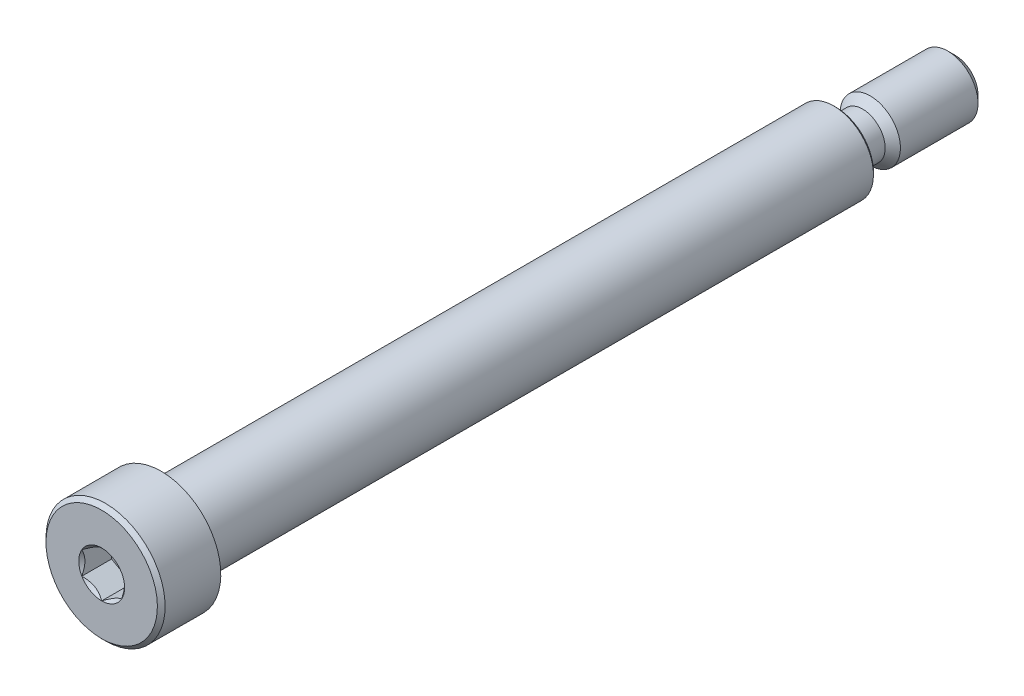
ISO-10303-21;
HEADER;
FILE_DESCRIPTION(('STEP AP214'),'2;1');
FILE_NAME('part.step','',(''),(''),'','','');
FILE_SCHEMA(('AUTOMOTIVE_DESIGN { 1 0 10303 214 1 1 1 1 }'));
ENDSEC;
DATA;
#1=APPLICATION_CONTEXT('core data for automotive mechanical design processes');
#2=APPLICATION_PROTOCOL_DEFINITION('international standard','automotive_design',2000,#1);
#3=PRODUCT_CONTEXT('',#1,'mechanical');
#4=PRODUCT('Part','Part','',(#3));
#5=PRODUCT_RELATED_PRODUCT_CATEGORY('part','',(#4));
#6=PRODUCT_DEFINITION_FORMATION('','',#4);
#7=PRODUCT_DEFINITION_CONTEXT('part definition',#1,'design');
#8=PRODUCT_DEFINITION('design','',#6,#7);
#9=PRODUCT_DEFINITION_SHAPE('','',#8);
#10=(LENGTH_UNIT() NAMED_UNIT(*) SI_UNIT(.MILLI.,.METRE.));
#11=(NAMED_UNIT(*) PLANE_ANGLE_UNIT() SI_UNIT($,.RADIAN.));
#12=(NAMED_UNIT(*) SI_UNIT($,.STERADIAN.) SOLID_ANGLE_UNIT());
#13=UNCERTAINTY_MEASURE_WITH_UNIT(LENGTH_MEASURE(1.E-05),#10,'distance_accuracy_value','');
#14=(GEOMETRIC_REPRESENTATION_CONTEXT(3) GLOBAL_UNCERTAINTY_ASSIGNED_CONTEXT((#13)) GLOBAL_UNIT_ASSIGNED_CONTEXT((#10,
#11,#12)) REPRESENTATION_CONTEXT('',''));
#15=CARTESIAN_POINT('',(0.,0.,0.));
#16=DIRECTION('',(0.,0.,1.));
#17=DIRECTION('',(1.,0.,0.));
#18=AXIS2_PLACEMENT_3D('',#15,#16,#17);
#19=CARTESIAN_POINT('',(0.,0.,0.));
#20=DIRECTION('',(0.,0.,1.));
#21=DIRECTION('',(0.,-1.,0.));
#22=AXIS2_PLACEMENT_3D('',#19,#20,#21);
#23=PLANE('',#22);
#24=CARTESIAN_POINT('',(0.,0.,0.));
#25=DIRECTION('',(0.,0.,1.));
#26=DIRECTION('',(1.,0.,0.));
#27=AXIS2_PLACEMENT_3D('',#24,#25,#26);
#28=CIRCLE('',#27,1.83308710467706);
#29=CARTESIAN_POINT('',(0.,-1.83308710467706,0.));
#30=VERTEX_POINT('',#29);
#31=CARTESIAN_POINT('',(1.58749999999999,-0.916543552338543,0.));
#32=VERTEX_POINT('',#31);
#33=EDGE_CURVE('E56',#30,#32,#28,.T.);
#34=ORIENTED_EDGE('',*,*,#33,.F.);
#35=CARTESIAN_POINT('',(-1.5875,-0.916543552338536,0.));
#36=VERTEX_POINT('',#35);
#37=EDGE_CURVE('E63',#36,#30,#28,.T.);
#38=ORIENTED_EDGE('',*,*,#37,.F.);
#39=CARTESIAN_POINT('',(-1.5875,0.916543552338528,0.));
#40=VERTEX_POINT('',#39);
#41=EDGE_CURVE('E136',#40,#36,#28,.T.);
#42=ORIENTED_EDGE('',*,*,#41,.F.);
#43=CARTESIAN_POINT('',(0.,1.83308710467706,0.));
#44=VERTEX_POINT('',#43);
#45=EDGE_CURVE('E131',#44,#40,#28,.T.);
#46=ORIENTED_EDGE('',*,*,#45,.F.);
#47=CARTESIAN_POINT('',(1.5875,0.916543552338529,0.));
#48=VERTEX_POINT('',#47);
#49=EDGE_CURVE('E104',#48,#44,#28,.T.);
#50=ORIENTED_EDGE('',*,*,#49,.F.);
#51=EDGE_CURVE('E95',#32,#48,#28,.T.);
#52=ORIENTED_EDGE('',*,*,#51,.F.);
#53=EDGE_LOOP('',(#34,#38,#42,#46,#50,#52));
#54=FACE_BOUND('',#53,.T.);
#55=CARTESIAN_POINT('',(0.,0.,0.));
#56=DIRECTION('',(0.,0.,1.));
#57=DIRECTION('',(0.,-1.,0.));
#58=AXIS2_PLACEMENT_3D('',#55,#56,#57);
#59=CIRCLE('',#58,4.45293749999999);
#60=CARTESIAN_POINT('',(0.,-4.45293749999999,0.));
#61=VERTEX_POINT('',#60);
#62=EDGE_CURVE('E221',#61,#61,#59,.T.);
#63=ORIENTED_EDGE('',*,*,#62,.T.);
#64=EDGE_LOOP('',(#63));
#65=FACE_BOUND('',#64,.T.);
#66=ADVANCED_FACE('F36',(#54,#65),#23,.T.);
#67=CARTESIAN_POINT('',(0.,0.,-68.2625));
#68=DIRECTION('',(0.,0.,-1.));
#69=DIRECTION('',(0.,1.,0.));
#70=AXIS2_PLACEMENT_3D('',#67,#68,#69);
#71=CYLINDRICAL_SURFACE('',#70,4.7625);
#72=CARTESIAN_POINT('',(0.,0.,-0.309562499999999));
#73=DIRECTION('',(0.,0.,1.));
#74=DIRECTION('',(0.,-1.,0.));
#75=AXIS2_PLACEMENT_3D('',#72,#73,#74);
#76=CIRCLE('',#75,4.7625);
#77=CARTESIAN_POINT('',(0.,-4.7625,-0.309562499999998));
#78=VERTEX_POINT('',#77);
#79=EDGE_CURVE('E224',#78,#78,#76,.F.);
#80=ORIENTED_EDGE('',*,*,#79,.T.);
#81=EDGE_LOOP('',(#80));
#82=FACE_BOUND('',#81,.T.);
#83=CARTESIAN_POINT('',(0.,0.,-4.7625));
#84=DIRECTION('',(0.,0.,-1.));
#85=DIRECTION('',(0.,1.,0.));
#86=AXIS2_PLACEMENT_3D('',#83,#84,#85);
#87=CIRCLE('',#86,4.7625);
#88=CARTESIAN_POINT('',(0.,4.7625,-4.7625));
#89=VERTEX_POINT('',#88);
#90=EDGE_CURVE('E265',#89,#89,#87,.T.);
#91=ORIENTED_EDGE('',*,*,#90,.F.);
#92=EDGE_LOOP('',(#91));
#93=FACE_BOUND('',#92,.T.);
#94=ADVANCED_FACE('F197',(#82,#93),#71,.T.);
#95=CARTESIAN_POINT('',(0.,-4.7625,-4.7625));
#96=DIRECTION('',(0.,0.,-1.));
#97=DIRECTION('',(0.,1.,0.));
#98=AXIS2_PLACEMENT_3D('',#95,#96,#97);
#99=PLANE('',#98);
#100=ORIENTED_EDGE('',*,*,#90,.T.);
#101=EDGE_LOOP('',(#100));
#102=FACE_BOUND('',#101,.T.);
#103=CARTESIAN_POINT('',(0.,0.,-4.7625));
#104=DIRECTION('',(0.,0.,-1.));
#105=DIRECTION('',(0.,1.,0.));
#106=AXIS2_PLACEMENT_3D('',#103,#104,#105);
#107=CIRCLE('',#106,3.17499999999998);
#108=CARTESIAN_POINT('',(0.,3.17499999999998,-4.7625));
#109=VERTEX_POINT('',#108);
#110=EDGE_CURVE('E256',#109,#109,#107,.T.);
#111=ORIENTED_EDGE('',*,*,#110,.F.);
#112=EDGE_LOOP('',(#111));
#113=FACE_BOUND('',#112,.T.);
#114=ADVANCED_FACE('F202',(#102,#113),#99,.T.);
#115=CARTESIAN_POINT('',(0.,0.,-68.2625));
#116=DIRECTION('',(0.,0.,-1.));
#117=DIRECTION('',(0.,1.,0.));
#118=AXIS2_PLACEMENT_3D('',#115,#116,#117);
#119=CYLINDRICAL_SURFACE('',#118,3.17499999999999);
#120=CARTESIAN_POINT('',(0.,0.,-58.5343));
#121=DIRECTION('',(0.,0.,-1.));
#122=DIRECTION('',(0.,1.,0.));
#123=AXIS2_PLACEMENT_3D('',#120,#121,#122);
#124=CIRCLE('',#123,3.17499999999999);
#125=CARTESIAN_POINT('',(0.,3.17499999999997,-58.5343));
#126=VERTEX_POINT('',#125);
#127=EDGE_CURVE('E50',#126,#126,#124,.F.);
#128=ORIENTED_EDGE('',*,*,#127,.T.);
#129=EDGE_LOOP('',(#128));
#130=FACE_BOUND('',#129,.T.);
#131=ORIENTED_EDGE('',*,*,#110,.T.);
#132=EDGE_LOOP('',(#131));
#133=FACE_BOUND('',#132,.T.);
#134=ADVANCED_FACE('F238',(#130,#133),#119,.T.);
#135=CARTESIAN_POINT('',(0.,-3.17500000000001,-58.7375));
#136=DIRECTION('',(0.,0.,-1.));
#137=DIRECTION('',(0.,1.,0.));
#138=AXIS2_PLACEMENT_3D('',#135,#136,#137);
#139=PLANE('',#138);
#140=CARTESIAN_POINT('',(0.,0.,-58.7375));
#141=DIRECTION('',(0.,0.,-1.));
#142=DIRECTION('',(0.,1.,0.));
#143=AXIS2_PLACEMENT_3D('',#140,#141,#142);
#144=CIRCLE('',#143,2.97179999999998);
#145=CARTESIAN_POINT('',(0.,2.97179999999997,-58.7375));
#146=VERTEX_POINT('',#145);
#147=EDGE_CURVE('E227',#146,#146,#144,.T.);
#148=ORIENTED_EDGE('',*,*,#147,.T.);
#149=EDGE_LOOP('',(#148));
#150=FACE_BOUND('',#149,.T.);
#151=CARTESIAN_POINT('',(0.,0.,-58.7375));
#152=DIRECTION('',(0.,0.,-1.));
#153=DIRECTION('',(0.,1.,0.));
#154=AXIS2_PLACEMENT_3D('',#151,#152,#153);
#155=CIRCLE('',#154,2.41300000000004);
#156=CARTESIAN_POINT('',(0.,2.41300000000003,-58.7375));
#157=VERTEX_POINT('',#156);
#158=EDGE_CURVE('E250',#157,#157,#155,.T.);
#159=ORIENTED_EDGE('',*,*,#158,.F.);
#160=EDGE_LOOP('',(#159));
#161=FACE_BOUND('',#160,.T.);
#162=ADVANCED_FACE('F243',(#150,#161),#139,.T.);
#163=CARTESIAN_POINT('',(0.,0.,-59.3471000000001));
#164=DIRECTION('',(0.,0.,-1.));
#165=DIRECTION('',(0.,1.,0.));
#166=AXIS2_PLACEMENT_3D('',#163,#164,#165);
#167=TOROIDAL_SURFACE('',#166,2.41300000000004,0.609600000000051);
#168=CARTESIAN_POINT('',(0.,0.,-59.3471000000001));
#169=DIRECTION('',(0.,0.,-1.));
#170=DIRECTION('',(0.,1.,0.));
#171=AXIS2_PLACEMENT_3D('',#168,#169,#170);
#172=CIRCLE('',#171,1.8034);
#173=CARTESIAN_POINT('',(0.,1.80339999999998,-59.3471000000001));
#174=VERTEX_POINT('',#173);
#175=EDGE_CURVE('E253',#174,#174,#172,.T.);
#176=ORIENTED_EDGE('',*,*,#175,.F.);
#177=EDGE_LOOP('',(#176));
#178=FACE_BOUND('',#177,.T.);
#179=ORIENTED_EDGE('',*,*,#158,.T.);
#180=EDGE_LOOP('',(#179));
#181=FACE_BOUND('',#180,.T.);
#182=ADVANCED_FACE('F246',(#178,#181),#167,.F.);
#183=CARTESIAN_POINT('',(0.,0.,-68.2625));
#184=DIRECTION('',(0.,0.,-1.));
#185=DIRECTION('',(0.,1.,0.));
#186=AXIS2_PLACEMENT_3D('',#183,#184,#185);
#187=CYLINDRICAL_SURFACE('',#186,1.8034);
#188=CARTESIAN_POINT('',(0.,0.,-60.8457));
#189=DIRECTION('',(0.,0.,-1.));
#190=DIRECTION('',(0.,1.,0.));
#191=AXIS2_PLACEMENT_3D('',#188,#189,#190);
#192=CIRCLE('',#191,1.8034);
#193=CARTESIAN_POINT('',(0.,1.80339999999998,-60.8457));
#194=VERTEX_POINT('',#193);
#195=EDGE_CURVE('E259',#194,#194,#192,.T.);
#196=ORIENTED_EDGE('',*,*,#195,.F.);
#197=EDGE_LOOP('',(#196));
#198=FACE_BOUND('',#197,.T.);
#199=ORIENTED_EDGE('',*,*,#175,.T.);
#200=EDGE_LOOP('',(#199));
#201=FACE_BOUND('',#200,.T.);
#202=ADVANCED_FACE('F281',(#198,#201),#187,.T.);
#203=CARTESIAN_POINT('',(0.,0.,-60.8457));
#204=DIRECTION('',(0.,0.,-1.));
#205=DIRECTION('',(0.,1.,0.));
#206=AXIS2_PLACEMENT_3D('',#203,#204,#205);
#207=CONICAL_SURFACE('',#206,1.8034,0.785398163397438);
#208=CARTESIAN_POINT('',(0.,0.,-61.4553000000001));
#209=DIRECTION('',(0.,0.,-1.));
#210=DIRECTION('',(0.,1.,0.));
#211=AXIS2_PLACEMENT_3D('',#208,#209,#210);
#212=CIRCLE('',#211,2.41300000000004);
#213=CARTESIAN_POINT('',(0.,2.41300000000003,-61.4553000000001));
#214=VERTEX_POINT('',#213);
#215=EDGE_CURVE('E252',#214,#214,#212,.F.);
#216=ORIENTED_EDGE('',*,*,#215,.T.);
#217=EDGE_LOOP('',(#216));
#218=FACE_BOUND('',#217,.T.);
#219=ORIENTED_EDGE('',*,*,#195,.T.);
#220=EDGE_LOOP('',(#219));
#221=FACE_BOUND('',#220,.T.);
#222=ADVANCED_FACE('F273',(#218,#221),#207,.T.);
#223=CARTESIAN_POINT('',(0.,-2.41300000000006,-68.2625));
#224=DIRECTION('',(0.,0.,-1.));
#225=DIRECTION('',(0.,1.,0.));
#226=AXIS2_PLACEMENT_3D('',#223,#224,#225);
#227=PLANE('',#226);
#228=CARTESIAN_POINT('',(0.,0.,-68.2625));
#229=DIRECTION('',(0.,0.,-1.));
#230=DIRECTION('',(0.,1.,0.));
#231=AXIS2_PLACEMENT_3D('',#228,#229,#230);
#232=CIRCLE('',#231,1.80975000000004);
#233=CARTESIAN_POINT('',(0.,1.80975000000002,-68.2625));
#234=VERTEX_POINT('',#233);
#235=EDGE_CURVE('E230',#234,#234,#232,.T.);
#236=ORIENTED_EDGE('',*,*,#235,.T.);
#237=EDGE_LOOP('',(#236));
#238=FACE_BOUND('',#237,.T.);
#239=ADVANCED_FACE('F270',(#238),#227,.T.);
#240=CARTESIAN_POINT('',(0.,0.,-68.2625));
#241=DIRECTION('',(0.,0.,-1.));
#242=DIRECTION('',(0.,1.,0.));
#243=AXIS2_PLACEMENT_3D('',#240,#241,#242);
#244=CYLINDRICAL_SURFACE('',#243,2.41300000000004);
#245=CARTESIAN_POINT('',(0.,0.,-67.65925));
#246=DIRECTION('',(0.,0.,-1.));
#247=DIRECTION('',(0.,1.,0.));
#248=AXIS2_PLACEMENT_3D('',#245,#246,#247);
#249=CIRCLE('',#248,2.41300000000004);
#250=CARTESIAN_POINT('',(0.,2.41300000000003,-67.65925));
#251=VERTEX_POINT('',#250);
#252=EDGE_CURVE('E225',#251,#251,#249,.F.);
#253=ORIENTED_EDGE('',*,*,#252,.T.);
#254=EDGE_LOOP('',(#253));
#255=FACE_BOUND('',#254,.T.);
#256=ORIENTED_EDGE('',*,*,#215,.F.);
#257=EDGE_LOOP('',(#256));
#258=FACE_BOUND('',#257,.T.);
#259=ADVANCED_FACE('F210',(#255,#258),#244,.T.);
#260=CARTESIAN_POINT('',(0.,0.,-68.2625));
#261=DIRECTION('',(0.,0.,1.));
#262=DIRECTION('',(0.,-1.,0.));
#263=AXIS2_PLACEMENT_3D('',#260,#261,#262);
#264=CONICAL_SURFACE('',#263,1.80975000000004,0.785398163397439);
#265=ORIENTED_EDGE('',*,*,#252,.F.);
#266=EDGE_LOOP('',(#265));
#267=FACE_BOUND('',#266,.T.);
#268=ORIENTED_EDGE('',*,*,#235,.F.);
#269=EDGE_LOOP('',(#268));
#270=FACE_BOUND('',#269,.T.);
#271=ADVANCED_FACE('F207',(#267,#270),#264,.T.);
#272=CARTESIAN_POINT('',(0.,0.,-0.309562499999999));
#273=DIRECTION('',(0.,0.,-1.));
#274=DIRECTION('',(0.,1.,0.));
#275=AXIS2_PLACEMENT_3D('',#272,#273,#274);
#276=CONICAL_SURFACE('',#275,4.7625,0.785398163397452);
#277=ORIENTED_EDGE('',*,*,#62,.F.);
#278=EDGE_LOOP('',(#277));
#279=FACE_BOUND('',#278,.T.);
#280=ORIENTED_EDGE('',*,*,#79,.F.);
#281=EDGE_LOOP('',(#280));
#282=FACE_BOUND('',#281,.T.);
#283=ADVANCED_FACE('F209',(#279,#282),#276,.T.);
#284=CARTESIAN_POINT('',(0.,0.,-58.7375));
#285=DIRECTION('',(0.,0.,1.));
#286=DIRECTION('',(0.,-1.,0.));
#287=AXIS2_PLACEMENT_3D('',#284,#285,#286);
#288=CONICAL_SURFACE('',#287,2.97179999999998,0.785398163397461);
#289=ORIENTED_EDGE('',*,*,#127,.F.);
#290=EDGE_LOOP('',(#289));
#291=FACE_BOUND('',#290,.T.);
#292=ORIENTED_EDGE('',*,*,#147,.F.);
#293=EDGE_LOOP('',(#292));
#294=FACE_BOUND('',#293,.T.);
#295=ADVANCED_FACE('F38',(#291,#294),#288,.T.);
#296=CARTESIAN_POINT('',(0.,0.,0.));
#297=DIRECTION('',(0.,0.,1.));
#298=DIRECTION('',(1.,0.,0.));
#299=AXIS2_PLACEMENT_3D('',#296,#297,#298);
#300=CONICAL_SURFACE('',#299,1.83308710467706,0.78539816339745);
#301=ORIENTED_EDGE('',*,*,#49,.T.);
#302=CARTESIAN_POINT('',(1.5877,0.916428082284689,0.000115480963707832));
#303=CARTESIAN_POINT('',(1.53312479190086,0.947937093371806,-0.0313691916294022));
#304=CARTESIAN_POINT('',(1.47763696320971,0.979973006203391,-0.0610049539864694));
#305=CARTESIAN_POINT('',(1.36449087915364,1.04529792829091,-0.115267739979174));
#306=CARTESIAN_POINT('',(1.30682185887062,1.07859315267522,-0.139864564866823));
#307=CARTESIAN_POINT('',(1.1905349781269,1.14573141457583,-0.181999635727418));
#308=CARTESIAN_POINT('',(1.13194674474407,1.17955734689075,-0.199643807270178));
#309=CARTESIAN_POINT('',(1.01348022674557,1.24795402294714,-0.226828529915031));
#310=CARTESIAN_POINT('',(0.953605562983894,1.28252267618758,-0.236389379304923));
#311=CARTESIAN_POINT('',(0.850418771876557,1.34209759781022,-0.245015586895992));
#312=CARTESIAN_POINT('',(0.807240015952287,1.36702686416637,-0.246292807190424));
#313=CARTESIAN_POINT('',(0.720953038535398,1.41684467380557,-0.244142944185296));
#314=CARTESIAN_POINT('',(0.677844847078612,1.44173319974742,-0.240714211450657));
#315=CARTESIAN_POINT('',(0.592046335002031,1.4912689937909,-0.229349005566657));
#316=CARTESIAN_POINT('',(0.549356408925406,1.51591603410293,-0.221408628198359));
#317=CARTESIAN_POINT('',(0.464693063478359,1.56479643938728,-0.201451585548899));
#318=CARTESIAN_POINT('',(0.422719959755075,1.58902962212064,-0.18943317079131));
#319=CARTESIAN_POINT('',(0.315211458113567,1.65109968448354,-0.153753102752755));
#320=CARTESIAN_POINT('',(0.250342771708901,1.68855163804125,-0.127401427696864));
#321=CARTESIAN_POINT('',(0.154961599380925,1.74361998356043,-0.082916463148299));
#322=CARTESIAN_POINT('',(0.123530699536158,1.76176662204667,-0.0672871421988697));
#323=CARTESIAN_POINT('',(0.0612469855696382,1.79772614107137,-0.0346015121389));
#324=CARTESIAN_POINT('',(0.0303939039605778,1.81553917604369,-0.0175458843430317));
#325=CARTESIAN_POINT('',(-0.00019999999999879,1.8332025747309,0.000115480963705172));
#326=B_SPLINE_CURVE_WITH_KNOTS('',3,(#302,#303,#304,#305,#306,#307,#308,#309,#310,#311,#312,
#313,#314,#315,#316,#317,#318,#319,#320,#321,#322,#323,#324,#325),.UNSPECIFIED.,.F.,.F.,(4,2,2,
2,2,2,2,2,2,2,2,4),(0.,0.211482650810817,0.424197870807277,0.633533884524816,0.84234265326335,
0.991755553727142,1.14122083674205,1.29081565918877,1.44047473906438,1.6781878086972,
1.79671410024894,1.91518409436631),.UNSPECIFIED.);
#327=EDGE_CURVE('E11',#48,#44,#326,.T.);
#328=ORIENTED_EDGE('',*,*,#327,.F.);
#329=EDGE_LOOP('',(#301,#328));
#330=FACE_BOUND('',#329,.T.);
#331=ADVANCED_FACE('F107',(#330),#300,.F.);
#332=ORIENTED_EDGE('',*,*,#45,.T.);
#333=CARTESIAN_POINT('',(0.000200000000001031,1.8332025747309,0.000115480963705317));
#334=CARTESIAN_POINT('',(-0.0543752080991352,1.80169356364378,-0.0313691916294044));
#335=CARTESIAN_POINT('',(-0.109863036790289,1.76965765081219,-0.0610049539864712));
#336=CARTESIAN_POINT('',(-0.223009120846357,1.70433272872467,-0.115267739979176));
#337=CARTESIAN_POINT('',(-0.280678141129379,1.67103750434037,-0.139864564866825));
#338=CARTESIAN_POINT('',(-0.396965021873101,1.60389924243976,-0.181999635727419));
#339=CARTESIAN_POINT('',(-0.455553255255928,1.57007331012484,-0.199643807270179));
#340=CARTESIAN_POINT('',(-0.574019773254428,1.50167663406845,-0.226828529915032));
#341=CARTESIAN_POINT('',(-0.633894437016102,1.467107980828,-0.236389379304924));
#342=CARTESIAN_POINT('',(-0.737081228123439,1.40753305920537,-0.245015586895993));
#343=CARTESIAN_POINT('',(-0.780259984047709,1.38260379284922,-0.246292807190425));
#344=CARTESIAN_POINT('',(-0.866546961464598,1.33278598321002,-0.244142944185296));
#345=CARTESIAN_POINT('',(-0.909655152921384,1.30789745726817,-0.240714211450658));
#346=CARTESIAN_POINT('',(-0.995453664997965,1.25836166322468,-0.229349005566658));
#347=CARTESIAN_POINT('',(-1.03814359107459,1.23371462291266,-0.221408628198359));
#348=CARTESIAN_POINT('',(-1.12280693652164,1.18483421762831,-0.2014515855489));
#349=CARTESIAN_POINT('',(-1.16478004024492,1.16060103489495,-0.189433170791311));
#350=CARTESIAN_POINT('',(-1.27228854188643,1.09853097253205,-0.153753102752755));
#351=CARTESIAN_POINT('',(-1.3371572282911,1.06107901897434,-0.127401427696864));
#352=CARTESIAN_POINT('',(-1.43253840061907,1.00601067345516,-0.0829164631482986));
#353=CARTESIAN_POINT('',(-1.46396930046384,0.987864034968911,-0.0672871421988691));
#354=CARTESIAN_POINT('',(-1.52625301443036,0.951904515944211,-0.034601512138899));
#355=CARTESIAN_POINT('',(-1.55710609603942,0.934091480971891,-0.0175458843430304));
#356=CARTESIAN_POINT('',(-1.5877,0.91642808228469,0.000115480963706775));
#357=B_SPLINE_CURVE_WITH_KNOTS('',3,(#333,#334,#335,#336,#337,#338,#339,#340,#341,#342,#343,
#344,#345,#346,#347,#348,#349,#350,#351,#352,#353,#354,#355,#356),.UNSPECIFIED.,.F.,.F.,(4,2,2,
2,2,2,2,2,2,2,2,4),(0.,0.211482650810816,0.424197870807274,0.633533884524813,0.842342653263345,
0.991755553727138,1.14122083674204,1.29081565918877,1.44047473906437,1.6781878086972,
1.79671410024894,1.91518409436631),.UNSPECIFIED.);
#358=EDGE_CURVE('E132',#44,#40,#357,.T.);
#359=ORIENTED_EDGE('',*,*,#358,.F.);
#360=EDGE_LOOP('',(#332,#359));
#361=FACE_BOUND('',#360,.T.);
#362=ADVANCED_FACE('F401',(#361),#300,.F.);
#363=ORIENTED_EDGE('',*,*,#41,.T.);
#364=CARTESIAN_POINT('',(-1.5875,-1.82796193726259,0.587987263053262));
#365=CARTESIAN_POINT('',(-1.5875,-1.78345227615059,0.55438665248245));
#366=CARTESIAN_POINT('',(-1.5875,-1.73869460859014,0.521115495112821));
#367=CARTESIAN_POINT('',(-1.5875,-1.64858256596373,0.455368117663873));
#368=CARTESIAN_POINT('',(-1.5875,-1.60322804392558,0.422892099235921));
#369=CARTESIAN_POINT('',(-1.5875,-1.46545441976762,0.326397611985418));
#370=CARTESIAN_POINT('',(-1.5875,-1.37200191342501,0.263830163460007));
#371=CARTESIAN_POINT('',(-1.5875,-1.17603564989745,0.141002804434972));
#372=CARTESIAN_POINT('',(-1.5875,-1.07330915468728,0.0810784496591046));
#373=CARTESIAN_POINT('',(-1.5875,-0.862725191083303,-0.0285359673271802));
#374=CARTESIAN_POINT('',(-1.5875,-0.754886591626397,-0.0782605310350632));
#375=CARTESIAN_POINT('',(-1.5875,-0.593019911814796,-0.139093925910703));
#376=CARTESIAN_POINT('',(-1.5875,-0.541388281953348,-0.156553547956909));
#377=CARTESIAN_POINT('',(-1.5875,-0.436878539644853,-0.187327632152252));
#378=CARTESIAN_POINT('',(-1.5875,-0.384000341596423,-0.200641808737995));
#379=CARTESIAN_POINT('',(-1.5875,-0.278196924179275,-0.222211694528));
#380=CARTESIAN_POINT('',(-1.5875,-0.22528965378016,-0.230554072010502));
#381=CARTESIAN_POINT('',(-1.5875,-0.118909299444438,-0.24201748229947));
#382=CARTESIAN_POINT('',(-1.5875,-0.0654363143610335,-0.245139412645061));
#383=CARTESIAN_POINT('',(-1.5875,0.0396125417767711,-0.245930358907866));
#384=CARTESIAN_POINT('',(-1.5875,0.0911870236203144,-0.243792656984369));
#385=CARTESIAN_POINT('',(-1.5875,0.193894009138673,-0.234608631517596));
#386=CARTESIAN_POINT('',(-1.5875,0.245026469388833,-0.227561831125049));
#387=CARTESIAN_POINT('',(-1.5875,0.347344844875251,-0.208824783303615));
#388=CARTESIAN_POINT('',(-1.5875,0.398516068928429,-0.197055516419633));
#389=CARTESIAN_POINT('',(-1.5875,0.49974044612459,-0.169499053465113));
#390=CARTESIAN_POINT('',(-1.5875,0.549793692439816,-0.153712193590009));
#391=CARTESIAN_POINT('',(-1.5875,0.70738077418726,-0.0980702216941557));
#392=CARTESIAN_POINT('',(-1.5875,0.812671634229884,-0.051878137425492));
#393=CARTESIAN_POINT('',(-1.5875,1.01830702558101,0.0508243359443616));
#394=CARTESIAN_POINT('',(-1.5875,1.11863208625861,0.10737179555309));
#395=CARTESIAN_POINT('',(-1.5875,1.3103677282283,0.224034193371491));
#396=CARTESIAN_POINT('',(-1.5875,1.40197355475198,0.283832216072681));
#397=CARTESIAN_POINT('',(-1.5875,1.53693633949296,0.376273802504082));
#398=CARTESIAN_POINT('',(-1.5875,1.58134147344183,0.407413627936379));
#399=CARTESIAN_POINT('',(-1.5875,1.66954488852479,0.470516819770575));
#400=CARTESIAN_POINT('',(-1.5875,1.7133433331845,0.502479957344863));
#401=CARTESIAN_POINT('',(-1.5875,1.75688919237298,0.534784489028341));
#402=B_SPLINE_CURVE_WITH_KNOTS('',3,(#364,#365,#366,#367,#368,#369,#370,#371,#372,#373,#374,
#375,#376,#377,#378,#379,#380,#381,#382,#383,#384,#385,#386,#387,#388,#389,#390,#391,#392,#393,
#394,#395,#396,#397,#398,#399,#400,#401),.UNSPECIFIED.,.F.,.F.,(4,2,2,2,2,2,2,2,2,2,2,2,2,2,2,2,
2,2,4),(0.,0.167300856006658,0.334643709885256,0.671883358358867,1.02837224619094,
1.38363464340873,1.54700775526169,1.71039211875551,1.87083807337659,2.03125644006704,
2.18586834446828,2.34049526931702,2.49782525404182,2.65514207759268,2.9990629992233,
3.34424006226482,3.67226428573993,3.83496498308973,3.99762093796192),.UNSPECIFIED.);
#403=EDGE_CURVE('E134',#40,#36,#402,.F.);
#404=ORIENTED_EDGE('',*,*,#403,.F.);
#405=EDGE_LOOP('',(#363,#404));
#406=FACE_BOUND('',#405,.T.);
#407=ADVANCED_FACE('F408',(#406),#300,.F.);
#408=ORIENTED_EDGE('',*,*,#37,.T.);
#409=CARTESIAN_POINT('',(-1.5877,-0.916428082284698,0.000115480963710651));
#410=CARTESIAN_POINT('',(-1.53312479190086,-0.947937093371814,-0.0313691916293989));
#411=CARTESIAN_POINT('',(-1.47763696320971,-0.979973006203399,-0.0610049539864657));
#412=CARTESIAN_POINT('',(-1.36449087915364,-1.04529792829092,-0.11526773997917));
#413=CARTESIAN_POINT('',(-1.30682185887062,-1.07859315267523,-0.139864564866819));
#414=CARTESIAN_POINT('',(-1.1905349781269,-1.14573141457584,-0.181999635727413));
#415=CARTESIAN_POINT('',(-1.13194674474407,-1.17955734689076,-0.199643807270173));
#416=CARTESIAN_POINT('',(-1.01348022674557,-1.24795402294715,-0.226828529915025));
#417=CARTESIAN_POINT('',(-0.953605562983896,-1.28252267618759,-0.236389379304917));
#418=CARTESIAN_POINT('',(-0.850418771876559,-1.34209759781022,-0.245015586895986));
#419=CARTESIAN_POINT('',(-0.807240015952289,-1.36702686416637,-0.246292807190418));
#420=CARTESIAN_POINT('',(-0.7209530385354,-1.41684467380557,-0.244142944185289));
#421=CARTESIAN_POINT('',(-0.677844847078613,-1.44173319974743,-0.240714211450651));
#422=CARTESIAN_POINT('',(-0.592046335002032,-1.49126899379091,-0.229349005566651));
#423=CARTESIAN_POINT('',(-0.549356408925408,-1.51591603410293,-0.221408628198353));
#424=CARTESIAN_POINT('',(-0.46469306347836,-1.56479643938728,-0.201451585548893));
#425=CARTESIAN_POINT('',(-0.422719959755076,-1.58902962212064,-0.189433170791304));
#426=CARTESIAN_POINT('',(-0.315211458113566,-1.65109968448354,-0.153753102752748));
#427=CARTESIAN_POINT('',(-0.2503427717089,-1.68855163804125,-0.127401427696857));
#428=CARTESIAN_POINT('',(-0.154961599380923,-1.74361998356043,-0.0829164631482915));
#429=CARTESIAN_POINT('',(-0.123530699536156,-1.76176662204668,-0.0672871421988619));
#430=CARTESIAN_POINT('',(-0.0612469855696354,-1.79772614107138,-0.0346015121388917));
#431=CARTESIAN_POINT('',(-0.0303939039605748,-1.8155391760437,-0.0175458843430231));
#432=CARTESIAN_POINT('',(0.000200000000002062,-1.8332025747309,0.000115480963713714));
#433=B_SPLINE_CURVE_WITH_KNOTS('',3,(#409,#410,#411,#412,#413,#414,#415,#416,#417,#418,#419,
#420,#421,#422,#423,#424,#425,#426,#427,#428,#429,#430,#431,#432),.UNSPECIFIED.,.F.,.F.,(4,2,2,
2,2,2,2,2,2,2,2,4),(0.,0.211482650810815,0.424197870807274,0.633533884524812,0.842342653263344,
0.991755553727137,1.14122083674204,1.29081565918877,1.44047473906437,1.6781878086972,
1.79671410024894,1.91518409436631),.UNSPECIFIED.);
#434=EDGE_CURVE('E162',#36,#30,#433,.T.);
#435=ORIENTED_EDGE('',*,*,#434,.F.);
#436=EDGE_LOOP('',(#408,#435));
#437=FACE_BOUND('',#436,.T.);
#438=ADVANCED_FACE('F416',(#437),#300,.F.);
#439=ORIENTED_EDGE('',*,*,#33,.T.);
#440=CARTESIAN_POINT('',(-0.000199999999997881,-1.8332025747309,0.000115480963714009));
#441=CARTESIAN_POINT('',(0.0543752080991385,-1.80169356364379,-0.0313691916293958));
#442=CARTESIAN_POINT('',(0.109863036790292,-1.7696576508122,-0.0610049539864627));
#443=CARTESIAN_POINT('',(0.223009120846361,-1.70433272872468,-0.115267739979167));
#444=CARTESIAN_POINT('',(0.280678141129383,-1.67103750434037,-0.139864564866816));
#445=CARTESIAN_POINT('',(0.396965021873105,-1.60389924243976,-0.181999635727411));
#446=CARTESIAN_POINT('',(0.455553255255933,-1.57007331012484,-0.19964380727017));
#447=CARTESIAN_POINT('',(0.574019773254433,-1.50167663406845,-0.226828529915024));
#448=CARTESIAN_POINT('',(0.633894437016107,-1.46710798082801,-0.236389379304915));
#449=CARTESIAN_POINT('',(0.737081228123444,-1.40753305920538,-0.245015586895984));
#450=CARTESIAN_POINT('',(0.780259984047714,-1.38260379284923,-0.246292807190416));
#451=CARTESIAN_POINT('',(0.866546961464604,-1.33278598321003,-0.244142944185288));
#452=CARTESIAN_POINT('',(0.90965515292139,-1.30789745726817,-0.240714211450649));
#453=CARTESIAN_POINT('',(0.995453664997972,-1.25836166322469,-0.229349005566649));
#454=CARTESIAN_POINT('',(1.0381435910746,-1.23371462291266,-0.221408628198351));
#455=CARTESIAN_POINT('',(1.12280693652164,-1.18483421762832,-0.201451585548891));
#456=CARTESIAN_POINT('',(1.16478004024493,-1.16060103489496,-0.189433170791301));
#457=CARTESIAN_POINT('',(1.27228854188644,-1.09853097253206,-0.153753102752747));
#458=CARTESIAN_POINT('',(1.3371572282911,-1.06107901897435,-0.127401427696856));
#459=CARTESIAN_POINT('',(1.43253840061908,-1.00601067345517,-0.0829164631482913));
#460=CARTESIAN_POINT('',(1.46396930046384,-0.987864034968919,-0.067287142198862));
#461=CARTESIAN_POINT('',(1.52625301443036,-0.95190451594422,-0.0346015121388923));
#462=CARTESIAN_POINT('',(1.55710609603942,-0.934091480971899,-0.017545884343024));
#463=CARTESIAN_POINT('',(1.5877,-0.916428082284699,0.000115480963712603));
#464=B_SPLINE_CURVE_WITH_KNOTS('',3,(#440,#441,#442,#443,#444,#445,#446,#447,#448,#449,#450,
#451,#452,#453,#454,#455,#456,#457,#458,#459,#460,#461,#462,#463),.UNSPECIFIED.,.F.,.F.,(4,2,2,
2,2,2,2,2,2,2,2,4),(0.,0.211482650810816,0.424197870807275,0.633533884524815,0.842342653263347,
0.991755553727141,1.14122083674205,1.29081565918877,1.44047473906438,1.6781878086972,
1.79671410024894,1.91518409436631),.UNSPECIFIED.);
#465=EDGE_CURVE('E119',#30,#32,#464,.T.);
#466=ORIENTED_EDGE('',*,*,#465,.F.);
#467=EDGE_LOOP('',(#439,#466));
#468=FACE_BOUND('',#467,.T.);
#469=ADVANCED_FACE('F155',(#468),#300,.F.);
#470=ORIENTED_EDGE('',*,*,#51,.T.);
#471=CARTESIAN_POINT('',(1.5875,-1.82796193726259,0.587987263053263));
#472=CARTESIAN_POINT('',(1.5875,-1.78345227615059,0.554386652482452));
#473=CARTESIAN_POINT('',(1.5875,-1.73869460859014,0.521115495112822));
#474=CARTESIAN_POINT('',(1.5875,-1.64858256596373,0.455368117663875));
#475=CARTESIAN_POINT('',(1.5875,-1.60322804392558,0.422892099235922));
#476=CARTESIAN_POINT('',(1.5875,-1.46545441976762,0.326397611985419));
#477=CARTESIAN_POINT('',(1.5875,-1.37200191342501,0.263830163460008));
#478=CARTESIAN_POINT('',(1.5875,-1.17603564989745,0.141002804434973));
#479=CARTESIAN_POINT('',(1.5875,-1.07330915468728,0.0810784496591058));
#480=CARTESIAN_POINT('',(1.5875,-0.862725191083303,-0.0285359673271791));
#481=CARTESIAN_POINT('',(1.5875,-0.754886591626397,-0.078260531035062));
#482=CARTESIAN_POINT('',(1.5875,-0.593019911814796,-0.139093925910701));
#483=CARTESIAN_POINT('',(1.5875,-0.541388281953348,-0.156553547956908));
#484=CARTESIAN_POINT('',(1.5875,-0.436878539644853,-0.18732763215225));
#485=CARTESIAN_POINT('',(1.5875,-0.384000341596423,-0.200641808737993));
#486=CARTESIAN_POINT('',(1.5875,-0.278196924179275,-0.222211694527998));
#487=CARTESIAN_POINT('',(1.5875,-0.225289653780159,-0.230554072010501));
#488=CARTESIAN_POINT('',(1.5875,-0.118909299444438,-0.242017482299468));
#489=CARTESIAN_POINT('',(1.5875,-0.0654363143610332,-0.245139412645059));
#490=CARTESIAN_POINT('',(1.5875,0.0396125417767714,-0.245930358907864));
#491=CARTESIAN_POINT('',(1.5875,0.0911870236203149,-0.243792656984367));
#492=CARTESIAN_POINT('',(1.5875,0.193894009138674,-0.234608631517594));
#493=CARTESIAN_POINT('',(1.5875,0.245026469388833,-0.227561831125047));
#494=CARTESIAN_POINT('',(1.5875,0.347344844875252,-0.208824783303613));
#495=CARTESIAN_POINT('',(1.5875,0.39851606892843,-0.197055516419631));
#496=CARTESIAN_POINT('',(1.5875,0.499740446124591,-0.169499053465111));
#497=CARTESIAN_POINT('',(1.5875,0.549793692439817,-0.153712193590007));
#498=CARTESIAN_POINT('',(1.5875,0.707380774187261,-0.098070221694154));
#499=CARTESIAN_POINT('',(1.5875,0.812671634229884,-0.0518781374254901));
#500=CARTESIAN_POINT('',(1.5875,1.01830702558102,0.0508243359443637));
#501=CARTESIAN_POINT('',(1.5875,1.11863208625861,0.107371795553092));
#502=CARTESIAN_POINT('',(1.5875,1.3103677282283,0.224034193371493));
#503=CARTESIAN_POINT('',(1.5875,1.40197355475198,0.283832216072683));
#504=CARTESIAN_POINT('',(1.5875,1.53693633949296,0.376273802504084));
#505=CARTESIAN_POINT('',(1.5875,1.58134147344183,0.407413627936381));
#506=CARTESIAN_POINT('',(1.5875,1.66954488852479,0.470516819770577));
#507=CARTESIAN_POINT('',(1.5875,1.7133433331845,0.502479957344865));
#508=CARTESIAN_POINT('',(1.5875,1.75688919237298,0.534784489028343));
#509=B_SPLINE_CURVE_WITH_KNOTS('',3,(#471,#472,#473,#474,#475,#476,#477,#478,#479,#480,#481,
#482,#483,#484,#485,#486,#487,#488,#489,#490,#491,#492,#493,#494,#495,#496,#497,#498,#499,#500,
#501,#502,#503,#504,#505,#506,#507,#508),.UNSPECIFIED.,.F.,.F.,(4,2,2,2,2,2,2,2,2,2,2,2,2,2,2,2,
2,2,4),(0.,0.167300856006658,0.334643709885257,0.671883358358867,1.02837224619094,
1.38363464340873,1.5470077552617,1.71039211875551,1.87083807337659,2.03125644006704,
2.18586834446828,2.34049526931702,2.49782525404183,2.65514207759269,2.9990629992233,
3.34424006226483,3.67226428573993,3.83496498308973,3.99762093796192),.UNSPECIFIED.);
#510=EDGE_CURVE('E99',#32,#48,#509,.T.);
#511=ORIENTED_EDGE('',*,*,#510,.F.);
#512=EDGE_LOOP('',(#470,#511));
#513=FACE_BOUND('',#512,.T.);
#514=ADVANCED_FACE('F97',(#513),#300,.F.);
#515=CARTESIAN_POINT('',(0.,0.,-2.38125));
#516=DIRECTION('',(0.,0.,1.));
#517=DIRECTION('',(1.,0.,0.));
#518=AXIS2_PLACEMENT_3D('',#515,#516,#517);
#519=PLANE('',#518);
#520=DIRECTION('',(0.,1.,0.));
#521=VECTOR('',#520,1.);
#522=CARTESIAN_POINT('',(1.5875,-0.916543552338537,-2.38125));
#523=LINE('',#522,#521);
#524=CARTESIAN_POINT('',(1.5875,-0.916543552338537,-2.38125));
#525=VERTEX_POINT('',#524);
#526=CARTESIAN_POINT('',(1.5875,0.916543552338527,-2.38125));
#527=VERTEX_POINT('',#526);
#528=EDGE_CURVE('E118',#525,#527,#523,.T.);
#529=ORIENTED_EDGE('',*,*,#528,.T.);
#530=DIRECTION('',(-0.866025403784439,0.5,0.));
#531=VECTOR('',#530,1.);
#532=CARTESIAN_POINT('',(1.5875,0.916543552338527,-2.38125));
#533=LINE('',#532,#531);
#534=CARTESIAN_POINT('',(0.,1.83308710467706,-2.38125));
#535=VERTEX_POINT('',#534);
#536=EDGE_CURVE('E123',#527,#535,#533,.T.);
#537=ORIENTED_EDGE('',*,*,#536,.T.);
#538=DIRECTION('',(-0.866025403784439,-0.5,0.));
#539=VECTOR('',#538,1.);
#540=CARTESIAN_POINT('',(0.,1.83308710467706,-2.38125));
#541=LINE('',#540,#539);
#542=CARTESIAN_POINT('',(-1.5875,0.916543552338528,-2.38125));
#543=VERTEX_POINT('',#542);
#544=EDGE_CURVE('E471',#535,#543,#541,.T.);
#545=ORIENTED_EDGE('',*,*,#544,.T.);
#546=DIRECTION('',(0.,-1.,0.));
#547=VECTOR('',#546,1.);
#548=CARTESIAN_POINT('',(-1.5875,0.916543552338528,-2.38125));
#549=LINE('',#548,#547);
#550=CARTESIAN_POINT('',(-1.5875,-0.916543552338536,-2.38125));
#551=VERTEX_POINT('',#550);
#552=EDGE_CURVE('E451',#543,#551,#549,.T.);
#553=ORIENTED_EDGE('',*,*,#552,.T.);
#554=DIRECTION('',(0.866025403784439,-0.5,0.));
#555=VECTOR('',#554,1.);
#556=CARTESIAN_POINT('',(-1.5875,-0.916543552338536,-2.38125));
#557=LINE('',#556,#555);
#558=CARTESIAN_POINT('',(0.,-1.83308710467707,-2.38125));
#559=VERTEX_POINT('',#558);
#560=EDGE_CURVE('E467',#551,#559,#557,.T.);
#561=ORIENTED_EDGE('',*,*,#560,.T.);
#562=DIRECTION('',(0.866025403784439,0.5,0.));
#563=VECTOR('',#562,1.);
#564=CARTESIAN_POINT('',(0.,-1.83308710467707,-2.38125));
#565=LINE('',#564,#563);
#566=EDGE_CURVE('E126',#559,#525,#565,.T.);
#567=ORIENTED_EDGE('',*,*,#566,.T.);
#568=EDGE_LOOP('',(#529,#537,#545,#553,#561,#567));
#569=FACE_BOUND('',#568,.T.);
#570=ADVANCED_FACE('F154',(#569),#519,.T.);
#571=CARTESIAN_POINT('',(1.5875,0.916543552338527,-2.38125));
#572=DIRECTION('',(0.5,0.866025403784439,0.));
#573=DIRECTION('',(-0.866025403784439,0.5,0.));
#574=AXIS2_PLACEMENT_3D('',#571,#572,#573);
#575=PLANE('',#574);
#576=DIRECTION('',(0.,0.,1.));
#577=VECTOR('',#576,1.);
#578=CARTESIAN_POINT('',(1.5875,0.916543552338527,-2.38125));
#579=LINE('',#578,#577);
#580=EDGE_CURVE('E115',#527,#48,#579,.T.);
#581=ORIENTED_EDGE('',*,*,#580,.T.);
#582=ORIENTED_EDGE('',*,*,#327,.T.);
#583=DIRECTION('',(0.,0.,1.));
#584=VECTOR('',#583,1.);
#585=CARTESIAN_POINT('',(0.,1.83308710467706,-2.38125));
#586=LINE('',#585,#584);
#587=EDGE_CURVE('E125',#535,#44,#586,.T.);
#588=ORIENTED_EDGE('',*,*,#587,.F.);
#589=ORIENTED_EDGE('',*,*,#536,.F.);
#590=EDGE_LOOP('',(#581,#582,#588,#589));
#591=FACE_BOUND('',#590,.T.);
#592=ADVANCED_FACE('F121',(#591),#575,.F.);
#593=CARTESIAN_POINT('',(0.,1.83308710467706,-2.38125));
#594=DIRECTION('',(-0.5,0.866025403784439,0.));
#595=DIRECTION('',(-0.866025403784439,-0.5,0.));
#596=AXIS2_PLACEMENT_3D('',#593,#594,#595);
#597=PLANE('',#596);
#598=ORIENTED_EDGE('',*,*,#587,.T.);
#599=ORIENTED_EDGE('',*,*,#358,.T.);
#600=DIRECTION('',(0.,0.,1.));
#601=VECTOR('',#600,1.);
#602=CARTESIAN_POINT('',(-1.5875,0.916543552338528,-2.38125));
#603=LINE('',#602,#601);
#604=EDGE_CURVE('E448',#543,#40,#603,.T.);
#605=ORIENTED_EDGE('',*,*,#604,.F.);
#606=ORIENTED_EDGE('',*,*,#544,.F.);
#607=EDGE_LOOP('',(#598,#599,#605,#606));
#608=FACE_BOUND('',#607,.T.);
#609=ADVANCED_FACE('F149',(#608),#597,.F.);
#610=CARTESIAN_POINT('',(-1.5875,0.916543552338528,-2.38125));
#611=DIRECTION('',(-1.,0.,0.));
#612=DIRECTION('',(0.,0.,1.));
#613=AXIS2_PLACEMENT_3D('',#610,#611,#612);
#614=PLANE('',#613);
#615=ORIENTED_EDGE('',*,*,#604,.T.);
#616=ORIENTED_EDGE('',*,*,#403,.T.);
#617=DIRECTION('',(0.,0.,1.));
#618=VECTOR('',#617,1.);
#619=CARTESIAN_POINT('',(-1.5875,-0.916543552338536,-2.38125));
#620=LINE('',#619,#618);
#621=EDGE_CURVE('E453',#551,#36,#620,.T.);
#622=ORIENTED_EDGE('',*,*,#621,.F.);
#623=ORIENTED_EDGE('',*,*,#552,.F.);
#624=EDGE_LOOP('',(#615,#616,#622,#623));
#625=FACE_BOUND('',#624,.T.);
#626=ADVANCED_FACE('F186',(#625),#614,.F.);
#627=CARTESIAN_POINT('',(-1.5875,-0.916543552338536,-2.38125));
#628=DIRECTION('',(-0.5,-0.866025403784439,0.));
#629=DIRECTION('',(0.866025403784439,-0.5,0.));
#630=AXIS2_PLACEMENT_3D('',#627,#628,#629);
#631=PLANE('',#630);
#632=ORIENTED_EDGE('',*,*,#621,.T.);
#633=ORIENTED_EDGE('',*,*,#434,.T.);
#634=DIRECTION('',(0.,0.,1.));
#635=VECTOR('',#634,1.);
#636=CARTESIAN_POINT('',(0.,-1.83308710467707,-2.38125));
#637=LINE('',#636,#635);
#638=EDGE_CURVE('E455',#559,#30,#637,.T.);
#639=ORIENTED_EDGE('',*,*,#638,.F.);
#640=ORIENTED_EDGE('',*,*,#560,.F.);
#641=EDGE_LOOP('',(#632,#633,#639,#640));
#642=FACE_BOUND('',#641,.T.);
#643=ADVANCED_FACE('F182',(#642),#631,.F.);
#644=CARTESIAN_POINT('',(0.,-1.83308710467707,-2.38125));
#645=DIRECTION('',(0.5,-0.866025403784439,0.));
#646=DIRECTION('',(0.866025403784439,0.5,0.));
#647=AXIS2_PLACEMENT_3D('',#644,#645,#646);
#648=PLANE('',#647);
#649=ORIENTED_EDGE('',*,*,#638,.T.);
#650=ORIENTED_EDGE('',*,*,#465,.T.);
#651=DIRECTION('',(0.,0.,1.));
#652=VECTOR('',#651,1.);
#653=CARTESIAN_POINT('',(1.5875,-0.916543552338537,-2.38125));
#654=LINE('',#653,#652);
#655=EDGE_CURVE('E117',#525,#32,#654,.T.);
#656=ORIENTED_EDGE('',*,*,#655,.F.);
#657=ORIENTED_EDGE('',*,*,#566,.F.);
#658=EDGE_LOOP('',(#649,#650,#656,#657));
#659=FACE_BOUND('',#658,.T.);
#660=ADVANCED_FACE('F179',(#659),#648,.F.);
#661=CARTESIAN_POINT('',(1.5875,-0.916543552338537,-2.38125));
#662=DIRECTION('',(1.,0.,0.));
#663=DIRECTION('',(0.,0.,-1.));
#664=AXIS2_PLACEMENT_3D('',#661,#662,#663);
#665=PLANE('',#664);
#666=ORIENTED_EDGE('',*,*,#655,.T.);
#667=ORIENTED_EDGE('',*,*,#510,.T.);
#668=ORIENTED_EDGE('',*,*,#580,.F.);
#669=ORIENTED_EDGE('',*,*,#528,.F.);
#670=EDGE_LOOP('',(#666,#667,#668,#669));
#671=FACE_BOUND('',#670,.T.);
#672=ADVANCED_FACE('F113',(#671),#665,.F.);
#673=CLOSED_SHELL('',(#66,#94,#114,#134,#162,#182,#202,#222,#239,#259,#271,#283,#295,#331,#362,
#407,#438,#469,#514,#570,#592,#609,#626,#643,#660,#672));
#674=MANIFOLD_SOLID_BREP('B2',#673);
#675=ADVANCED_BREP_SHAPE_REPRESENTATION('',(#18,#674),#14);
#676=SHAPE_DEFINITION_REPRESENTATION(#9,#675);
ENDSEC;
END-ISO-10303-21;
